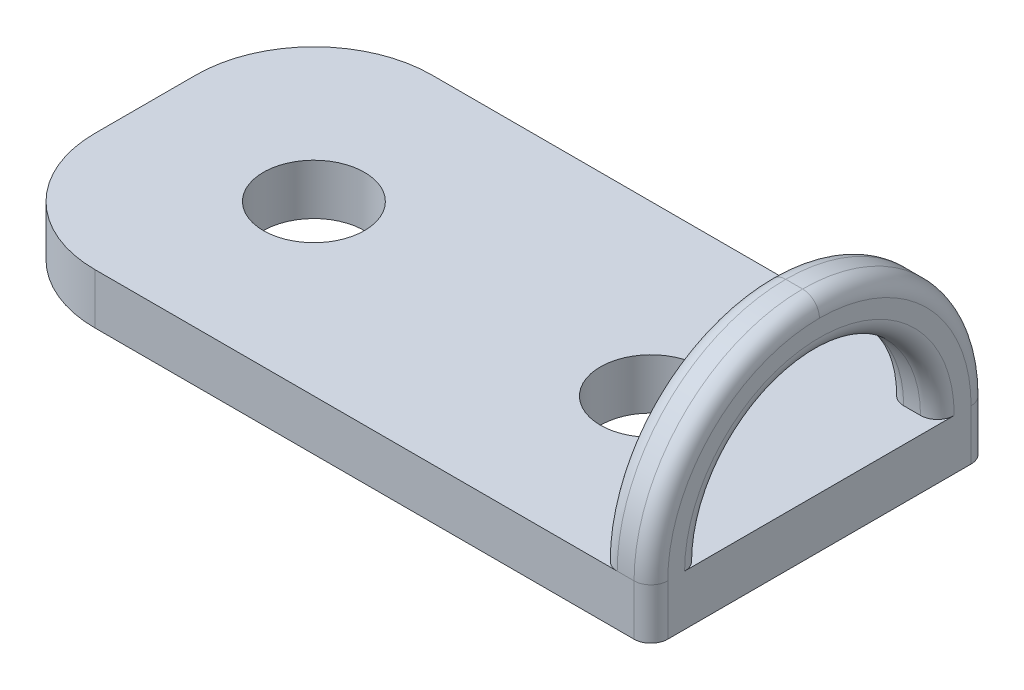
ISO-10303-21;
HEADER;
FILE_DESCRIPTION(('STEP AP214'),'2;1');
FILE_NAME('part.step','',(''),(''),'','','');
FILE_SCHEMA(('AUTOMOTIVE_DESIGN { 1 0 10303 214 1 1 1 1 }'));
ENDSEC;
DATA;
#1=APPLICATION_CONTEXT('core data for automotive mechanical design processes');
#2=APPLICATION_PROTOCOL_DEFINITION('international standard','automotive_design',2000,#1);
#3=PRODUCT_CONTEXT('',#1,'mechanical');
#4=PRODUCT('Part','Part','',(#3));
#5=PRODUCT_RELATED_PRODUCT_CATEGORY('part','',(#4));
#6=PRODUCT_DEFINITION_FORMATION('','',#4);
#7=PRODUCT_DEFINITION_CONTEXT('part definition',#1,'design');
#8=PRODUCT_DEFINITION('design','',#6,#7);
#9=PRODUCT_DEFINITION_SHAPE('','',#8);
#10=(LENGTH_UNIT() NAMED_UNIT(*) SI_UNIT(.MILLI.,.METRE.));
#11=(NAMED_UNIT(*) PLANE_ANGLE_UNIT() SI_UNIT($,.RADIAN.));
#12=(NAMED_UNIT(*) SI_UNIT($,.STERADIAN.) SOLID_ANGLE_UNIT());
#13=UNCERTAINTY_MEASURE_WITH_UNIT(LENGTH_MEASURE(1.E-05),#10,'distance_accuracy_value','');
#14=(GEOMETRIC_REPRESENTATION_CONTEXT(3) GLOBAL_UNCERTAINTY_ASSIGNED_CONTEXT((#13)) GLOBAL_UNIT_ASSIGNED_CONTEXT((#10,
#11,#12)) REPRESENTATION_CONTEXT('',''));
#15=CARTESIAN_POINT('',(0.,0.,0.));
#16=DIRECTION('',(0.,0.,1.));
#17=DIRECTION('',(1.,0.,0.));
#18=AXIS2_PLACEMENT_3D('',#15,#16,#17);
#19=CARTESIAN_POINT('',(-33.,3.,13.));
#20=DIRECTION('',(0.,-1.,0.));
#21=DIRECTION('',(0.,0.,-1.));
#22=AXIS2_PLACEMENT_3D('',#19,#20,#21);
#23=PLANE('',#22);
#24=CARTESIAN_POINT('',(-10.,3.,9.99999999999999));
#25=DIRECTION('',(0.,1.,0.));
#26=DIRECTION('',(0.,0.,1.));
#27=AXIS2_PLACEMENT_3D('',#24,#25,#26);
#28=CIRCLE('',#27,3.);
#29=CARTESIAN_POINT('',(-10.,3.,13.));
#30=VERTEX_POINT('',#29);
#31=EDGE_CURVE('E173',#30,#30,#28,.T.);
#32=ORIENTED_EDGE('',*,*,#31,.F.);
#33=EDGE_LOOP('',(#32));
#34=FACE_BOUND('',#33,.T.);
#35=CARTESIAN_POINT('',(-30.,3.,9.99999999999999));
#36=DIRECTION('',(0.,1.,0.));
#37=DIRECTION('',(0.,0.,1.));
#38=AXIS2_PLACEMENT_3D('',#35,#36,#37);
#39=CIRCLE('',#38,3.);
#40=CARTESIAN_POINT('',(-30.,3.,13.));
#41=VERTEX_POINT('',#40);
#42=EDGE_CURVE('E180',#41,#41,#39,.T.);
#43=ORIENTED_EDGE('',*,*,#42,.F.);
#44=EDGE_LOOP('',(#43));
#45=FACE_BOUND('',#44,.T.);
#46=DIRECTION('',(0.,0.,1.));
#47=VECTOR('',#46,1.);
#48=CARTESIAN_POINT('',(-3.,3.,0.));
#49=LINE('',#48,#47);
#50=CARTESIAN_POINT('',(-3.,3.,0.999999999999999));
#51=VERTEX_POINT('',#50);
#52=CARTESIAN_POINT('',(-3.,3.,2.));
#53=VERTEX_POINT('',#52);
#54=EDGE_CURVE('E172',#51,#53,#49,.T.);
#55=ORIENTED_EDGE('',*,*,#54,.F.);
#56=CARTESIAN_POINT('',(-2.,3.,0.999999999999999));
#57=DIRECTION('',(0.,-1.,0.));
#58=DIRECTION('',(0.,0.,-1.));
#59=AXIS2_PLACEMENT_3D('',#56,#57,#58);
#60=CIRCLE('',#59,1.);
#61=CARTESIAN_POINT('',(-2.,3.,0.));
#62=VERTEX_POINT('',#61);
#63=EDGE_CURVE('E12',#51,#62,#60,.T.);
#64=ORIENTED_EDGE('',*,*,#63,.T.);
#65=DIRECTION('',(-1.,0.,0.));
#66=VECTOR('',#65,1.);
#67=CARTESIAN_POINT('',(0.,3.,0.));
#68=LINE('',#67,#66);
#69=CARTESIAN_POINT('',(-33.,3.,0.));
#70=VERTEX_POINT('',#69);
#71=EDGE_CURVE('E80',#62,#70,#68,.T.);
#72=ORIENTED_EDGE('',*,*,#71,.T.);
#73=CARTESIAN_POINT('',(-33.,3.,7.));
#74=DIRECTION('',(0.,1.,0.));
#75=DIRECTION('',(0.,0.,1.));
#76=AXIS2_PLACEMENT_3D('',#73,#74,#75);
#77=CIRCLE('',#76,7.);
#78=CARTESIAN_POINT('',(-40.,3.,7.00000000000005));
#79=VERTEX_POINT('',#78);
#80=EDGE_CURVE('E187',#70,#79,#77,.T.);
#81=ORIENTED_EDGE('',*,*,#80,.T.);
#82=DIRECTION('',(0.,0.,1.));
#83=VECTOR('',#82,1.);
#84=CARTESIAN_POINT('',(-40.,3.,7.00000000000005));
#85=LINE('',#84,#83);
#86=CARTESIAN_POINT('',(-40.,3.,13.));
#87=VERTEX_POINT('',#86);
#88=EDGE_CURVE('E191',#79,#87,#85,.T.);
#89=ORIENTED_EDGE('',*,*,#88,.T.);
#90=CARTESIAN_POINT('',(-33.,3.,13.));
#91=DIRECTION('',(0.,1.,0.));
#92=DIRECTION('',(0.,0.,-1.));
#93=AXIS2_PLACEMENT_3D('',#90,#91,#92);
#94=CIRCLE('',#93,7.);
#95=CARTESIAN_POINT('',(-32.9999999999999,3.,20.));
#96=VERTEX_POINT('',#95);
#97=EDGE_CURVE('E194',#87,#96,#94,.T.);
#98=ORIENTED_EDGE('',*,*,#97,.T.);
#99=DIRECTION('',(1.,0.,0.));
#100=VECTOR('',#99,1.);
#101=CARTESIAN_POINT('',(0.,3.,20.));
#102=LINE('',#101,#100);
#103=CARTESIAN_POINT('',(-2.,3.,20.));
#104=VERTEX_POINT('',#103);
#105=EDGE_CURVE('E101',#96,#104,#102,.T.);
#106=ORIENTED_EDGE('',*,*,#105,.T.);
#107=CARTESIAN_POINT('',(-2.,3.,19.));
#108=DIRECTION('',(0.,-1.,0.));
#109=DIRECTION('',(0.,0.,-1.));
#110=AXIS2_PLACEMENT_3D('',#107,#108,#109);
#111=CIRCLE('',#110,1.);
#112=CARTESIAN_POINT('',(-3.,3.,19.));
#113=VERTEX_POINT('',#112);
#114=EDGE_CURVE('E271',#104,#113,#111,.T.);
#115=ORIENTED_EDGE('',*,*,#114,.T.);
#116=CARTESIAN_POINT('',(-3.,3.,18.));
#117=VERTEX_POINT('',#116);
#118=EDGE_CURVE('E169',#117,#113,#49,.T.);
#119=ORIENTED_EDGE('',*,*,#118,.F.);
#120=CARTESIAN_POINT('',(-2.,3.,18.));
#121=DIRECTION('',(0.,-1.,0.));
#122=DIRECTION('',(0.,0.,-1.));
#123=AXIS2_PLACEMENT_3D('',#120,#121,#122);
#124=CIRCLE('',#123,1.);
#125=CARTESIAN_POINT('',(-2.,3.,17.));
#126=VERTEX_POINT('',#125);
#127=EDGE_CURVE('E72',#117,#126,#124,.T.);
#128=ORIENTED_EDGE('',*,*,#127,.T.);
#129=DIRECTION('',(-1.,0.,0.));
#130=VECTOR('',#129,1.);
#131=CARTESIAN_POINT('',(0.,3.,17.));
#132=LINE('',#131,#130);
#133=CARTESIAN_POINT('',(-0.999999999999998,3.,17.));
#134=VERTEX_POINT('',#133);
#135=EDGE_CURVE('E156',#134,#126,#132,.T.);
#136=ORIENTED_EDGE('',*,*,#135,.F.);
#137=CARTESIAN_POINT('',(-0.999999999999998,3.,18.));
#138=DIRECTION('',(0.,-1.,0.));
#139=DIRECTION('',(0.,0.,-1.));
#140=AXIS2_PLACEMENT_3D('',#137,#138,#139);
#141=CIRCLE('',#140,1.);
#142=CARTESIAN_POINT('',(0.,3.,18.));
#143=VERTEX_POINT('',#142);
#144=EDGE_CURVE('E149',#134,#143,#141,.T.);
#145=ORIENTED_EDGE('',*,*,#144,.T.);
#146=DIRECTION('',(0.,0.,1.));
#147=VECTOR('',#146,1.);
#148=CARTESIAN_POINT('',(0.,3.,3.));
#149=LINE('',#148,#147);
#150=CARTESIAN_POINT('',(0.,3.,2.));
#151=VERTEX_POINT('',#150);
#152=EDGE_CURVE('E161',#151,#143,#149,.T.);
#153=ORIENTED_EDGE('',*,*,#152,.F.);
#154=CARTESIAN_POINT('',(-1.,3.,2.));
#155=DIRECTION('',(0.,-1.,0.));
#156=DIRECTION('',(0.,0.,-1.));
#157=AXIS2_PLACEMENT_3D('',#154,#155,#156);
#158=CIRCLE('',#157,1.);
#159=CARTESIAN_POINT('',(-1.,3.,3.));
#160=VERTEX_POINT('',#159);
#161=EDGE_CURVE('E160',#151,#160,#158,.T.);
#162=ORIENTED_EDGE('',*,*,#161,.T.);
#163=DIRECTION('',(-1.,0.,0.));
#164=VECTOR('',#163,1.);
#165=CARTESIAN_POINT('',(0.,3.,3.));
#166=LINE('',#165,#164);
#167=CARTESIAN_POINT('',(-2.,3.,3.));
#168=VERTEX_POINT('',#167);
#169=EDGE_CURVE('E154',#160,#168,#166,.T.);
#170=ORIENTED_EDGE('',*,*,#169,.T.);
#171=CARTESIAN_POINT('',(-2.,3.,2.));
#172=DIRECTION('',(0.,-1.,0.));
#173=DIRECTION('',(0.,0.,-1.));
#174=AXIS2_PLACEMENT_3D('',#171,#172,#173);
#175=CIRCLE('',#174,1.);
#176=EDGE_CURVE('E142',#168,#53,#175,.T.);
#177=ORIENTED_EDGE('',*,*,#176,.T.);
#178=EDGE_LOOP('',(#55,#64,#72,#81,#89,#98,#106,#115,#119,#128,#136,#145,#153,#162,#170,#177));
#179=FACE_BOUND('',#178,.T.);
#180=ADVANCED_FACE('F63',(#34,#45,#179),#23,.F.);
#181=CARTESIAN_POINT('',(-33.,0.,13.));
#182=DIRECTION('',(0.,-1.,0.));
#183=DIRECTION('',(0.,0.,-1.));
#184=AXIS2_PLACEMENT_3D('',#181,#182,#183);
#185=PLANE('',#184);
#186=CARTESIAN_POINT('',(-30.,0.,9.99999999999999));
#187=DIRECTION('',(0.,1.,0.));
#188=DIRECTION('',(0.,0.,1.));
#189=AXIS2_PLACEMENT_3D('',#186,#187,#188);
#190=CIRCLE('',#189,3.);
#191=CARTESIAN_POINT('',(-30.,0.,13.));
#192=VERTEX_POINT('',#191);
#193=EDGE_CURVE('E176',#192,#192,#190,.T.);
#194=ORIENTED_EDGE('',*,*,#193,.T.);
#195=EDGE_LOOP('',(#194));
#196=FACE_BOUND('',#195,.T.);
#197=DIRECTION('',(-1.,0.,0.));
#198=VECTOR('',#197,1.);
#199=CARTESIAN_POINT('',(0.,0.,0.));
#200=LINE('',#199,#198);
#201=CARTESIAN_POINT('',(-1.,0.,0.));
#202=VERTEX_POINT('',#201);
#203=CARTESIAN_POINT('',(-33.,0.,0.));
#204=VERTEX_POINT('',#203);
#205=EDGE_CURVE('E200',#202,#204,#200,.T.);
#206=ORIENTED_EDGE('',*,*,#205,.F.);
#207=CARTESIAN_POINT('',(-1.,0.,1.));
#208=DIRECTION('',(0.,-1.,0.));
#209=DIRECTION('',(0.,0.,-1.));
#210=AXIS2_PLACEMENT_3D('',#207,#208,#209);
#211=CIRCLE('',#210,1.);
#212=CARTESIAN_POINT('',(0.,0.,1.));
#213=VERTEX_POINT('',#212);
#214=EDGE_CURVE('E236',#202,#213,#211,.T.);
#215=ORIENTED_EDGE('',*,*,#214,.T.);
#216=DIRECTION('',(0.,0.,-1.));
#217=VECTOR('',#216,1.);
#218=CARTESIAN_POINT('',(0.,0.,0.));
#219=LINE('',#218,#217);
#220=CARTESIAN_POINT('',(0.,0.,19.));
#221=VERTEX_POINT('',#220);
#222=EDGE_CURVE('E183',#221,#213,#219,.T.);
#223=ORIENTED_EDGE('',*,*,#222,.F.);
#224=CARTESIAN_POINT('',(-0.999999999999998,0.,19.));
#225=DIRECTION('',(0.,-1.,0.));
#226=DIRECTION('',(0.,0.,-1.));
#227=AXIS2_PLACEMENT_3D('',#224,#225,#226);
#228=CIRCLE('',#227,1.);
#229=CARTESIAN_POINT('',(-0.999999999999997,0.,20.));
#230=VERTEX_POINT('',#229);
#231=EDGE_CURVE('E233',#221,#230,#228,.T.);
#232=ORIENTED_EDGE('',*,*,#231,.T.);
#233=DIRECTION('',(1.,0.,0.));
#234=VECTOR('',#233,1.);
#235=CARTESIAN_POINT('',(0.,0.,20.));
#236=LINE('',#235,#234);
#237=CARTESIAN_POINT('',(-32.9999999999999,0.,20.));
#238=VERTEX_POINT('',#237);
#239=EDGE_CURVE('E188',#238,#230,#236,.T.);
#240=ORIENTED_EDGE('',*,*,#239,.F.);
#241=CARTESIAN_POINT('',(-33.,0.,13.));
#242=DIRECTION('',(0.,1.,0.));
#243=DIRECTION('',(0.,0.,-1.));
#244=AXIS2_PLACEMENT_3D('',#241,#242,#243);
#245=CIRCLE('',#244,7.);
#246=CARTESIAN_POINT('',(-40.,0.,13.));
#247=VERTEX_POINT('',#246);
#248=EDGE_CURVE('E209',#247,#238,#245,.T.);
#249=ORIENTED_EDGE('',*,*,#248,.F.);
#250=DIRECTION('',(0.,0.,1.));
#251=VECTOR('',#250,1.);
#252=CARTESIAN_POINT('',(-40.,0.,7.00000000000005));
#253=LINE('',#252,#251);
#254=CARTESIAN_POINT('',(-40.,0.,7.00000000000005));
#255=VERTEX_POINT('',#254);
#256=EDGE_CURVE('E206',#255,#247,#253,.T.);
#257=ORIENTED_EDGE('',*,*,#256,.F.);
#258=CARTESIAN_POINT('',(-33.,0.,7.));
#259=DIRECTION('',(0.,1.,0.));
#260=DIRECTION('',(0.,0.,1.));
#261=AXIS2_PLACEMENT_3D('',#258,#259,#260);
#262=CIRCLE('',#261,7.);
#263=EDGE_CURVE('E203',#204,#255,#262,.T.);
#264=ORIENTED_EDGE('',*,*,#263,.F.);
#265=EDGE_LOOP('',(#206,#215,#223,#232,#240,#249,#257,#264));
#266=FACE_BOUND('',#265,.T.);
#267=CARTESIAN_POINT('',(-10.,0.,9.99999999999999));
#268=DIRECTION('',(0.,1.,0.));
#269=DIRECTION('',(0.,0.,1.));
#270=AXIS2_PLACEMENT_3D('',#267,#268,#269);
#271=CIRCLE('',#270,3.);
#272=CARTESIAN_POINT('',(-10.,0.,13.));
#273=VERTEX_POINT('',#272);
#274=EDGE_CURVE('E177',#273,#273,#271,.T.);
#275=ORIENTED_EDGE('',*,*,#274,.T.);
#276=EDGE_LOOP('',(#275));
#277=FACE_BOUND('',#276,.T.);
#278=ADVANCED_FACE('F308',(#196,#266,#277),#185,.T.);
#279=CARTESIAN_POINT('',(0.,3.,0.));
#280=DIRECTION('',(-1.,0.,0.));
#281=DIRECTION('',(0.,0.,1.));
#282=AXIS2_PLACEMENT_3D('',#279,#280,#281);
#283=PLANE('',#282);
#284=ORIENTED_EDGE('',*,*,#222,.T.);
#285=DIRECTION('',(0.,-1.,0.));
#286=VECTOR('',#285,1.);
#287=CARTESIAN_POINT('',(0.,3.,1.));
#288=LINE('',#287,#286);
#289=CARTESIAN_POINT('',(0.,3.,1.));
#290=VERTEX_POINT('',#289);
#291=EDGE_CURVE('E248',#213,#290,#288,.F.);
#292=ORIENTED_EDGE('',*,*,#291,.T.);
#293=CARTESIAN_POINT('',(0.,3.,10.));
#294=DIRECTION('',(-1.,0.,0.));
#295=DIRECTION('',(0.,0.,1.));
#296=AXIS2_PLACEMENT_3D('',#293,#294,#295);
#297=CIRCLE('',#296,9.);
#298=CARTESIAN_POINT('',(0.,12.,10.));
#299=VERTEX_POINT('',#298);
#300=EDGE_CURVE('E239',#290,#299,#297,.F.);
#301=ORIENTED_EDGE('',*,*,#300,.T.);
#302=CARTESIAN_POINT('',(0.,3.,10.));
#303=DIRECTION('',(-1.,0.,0.));
#304=DIRECTION('',(0.,0.,1.));
#305=AXIS2_PLACEMENT_3D('',#302,#303,#304);
#306=CIRCLE('',#305,9.);
#307=CARTESIAN_POINT('',(0.,3.,19.));
#308=VERTEX_POINT('',#307);
#309=EDGE_CURVE('E242',#299,#308,#306,.F.);
#310=ORIENTED_EDGE('',*,*,#309,.T.);
#311=DIRECTION('',(0.,-1.,0.));
#312=VECTOR('',#311,1.);
#313=CARTESIAN_POINT('',(0.,3.,19.));
#314=LINE('',#313,#312);
#315=EDGE_CURVE('E245',#308,#221,#314,.T.);
#316=ORIENTED_EDGE('',*,*,#315,.T.);
#317=EDGE_LOOP('',(#284,#292,#301,#310,#316));
#318=FACE_BOUND('',#317,.T.);
#319=CARTESIAN_POINT('',(0.,3.,9.99999999999999));
#320=DIRECTION('',(-1.,0.,0.));
#321=DIRECTION('',(0.,0.,1.));
#322=AXIS2_PLACEMENT_3D('',#319,#320,#321);
#323=CIRCLE('',#322,7.99999999999999);
#324=EDGE_CURVE('E251',#143,#151,#323,.T.);
#325=ORIENTED_EDGE('',*,*,#324,.T.);
#326=ORIENTED_EDGE('',*,*,#152,.T.);
#327=EDGE_LOOP('',(#325,#326));
#328=FACE_BOUND('',#327,.T.);
#329=ADVANCED_FACE('F300',(#318,#328),#283,.F.);
#330=CARTESIAN_POINT('',(0.,3.,0.));
#331=DIRECTION('',(0.,0.,1.));
#332=DIRECTION('',(1.,0.,0.));
#333=AXIS2_PLACEMENT_3D('',#330,#331,#332);
#334=PLANE('',#333);
#335=DIRECTION('',(-1.,0.,0.));
#336=VECTOR('',#335,1.);
#337=CARTESIAN_POINT('',(0.,3.,0.));
#338=LINE('',#337,#336);
#339=CARTESIAN_POINT('',(-1.,3.,0.));
#340=VERTEX_POINT('',#339);
#341=EDGE_CURVE('E224',#62,#340,#338,.F.);
#342=ORIENTED_EDGE('',*,*,#341,.T.);
#343=DIRECTION('',(0.,-1.,0.));
#344=VECTOR('',#343,1.);
#345=CARTESIAN_POINT('',(-1.,3.,0.));
#346=LINE('',#345,#344);
#347=EDGE_CURVE('E228',#340,#202,#346,.T.);
#348=ORIENTED_EDGE('',*,*,#347,.T.);
#349=ORIENTED_EDGE('',*,*,#205,.T.);
#350=DIRECTION('',(0.,-1.,0.));
#351=VECTOR('',#350,1.);
#352=CARTESIAN_POINT('',(-33.,3.,0.));
#353=LINE('',#352,#351);
#354=EDGE_CURVE('E221',#70,#204,#353,.T.);
#355=ORIENTED_EDGE('',*,*,#354,.F.);
#356=ORIENTED_EDGE('',*,*,#71,.F.);
#357=EDGE_LOOP('',(#342,#348,#349,#355,#356));
#358=FACE_BOUND('',#357,.T.);
#359=ADVANCED_FACE('F319',(#358),#334,.F.);
#360=CARTESIAN_POINT('',(-33.,3.,7.));
#361=DIRECTION('',(0.,-1.,0.));
#362=DIRECTION('',(0.,0.,-1.));
#363=AXIS2_PLACEMENT_3D('',#360,#361,#362);
#364=CYLINDRICAL_SURFACE('',#363,7.);
#365=ORIENTED_EDGE('',*,*,#263,.T.);
#366=DIRECTION('',(0.,-1.,0.));
#367=VECTOR('',#366,1.);
#368=CARTESIAN_POINT('',(-40.,3.,7.00000000000005));
#369=LINE('',#368,#367);
#370=EDGE_CURVE('E218',#79,#255,#369,.T.);
#371=ORIENTED_EDGE('',*,*,#370,.F.);
#372=ORIENTED_EDGE('',*,*,#80,.F.);
#373=ORIENTED_EDGE('',*,*,#354,.T.);
#374=EDGE_LOOP('',(#365,#371,#372,#373));
#375=FACE_BOUND('',#374,.T.);
#376=ADVANCED_FACE('F371',(#375),#364,.T.);
#377=CARTESIAN_POINT('',(-40.,3.,7.00000000000005));
#378=DIRECTION('',(1.,0.,0.));
#379=DIRECTION('',(0.,0.,-1.));
#380=AXIS2_PLACEMENT_3D('',#377,#378,#379);
#381=PLANE('',#380);
#382=ORIENTED_EDGE('',*,*,#256,.T.);
#383=DIRECTION('',(0.,-1.,0.));
#384=VECTOR('',#383,1.);
#385=CARTESIAN_POINT('',(-40.,3.,13.));
#386=LINE('',#385,#384);
#387=EDGE_CURVE('E215',#87,#247,#386,.T.);
#388=ORIENTED_EDGE('',*,*,#387,.F.);
#389=ORIENTED_EDGE('',*,*,#88,.F.);
#390=ORIENTED_EDGE('',*,*,#370,.T.);
#391=EDGE_LOOP('',(#382,#388,#389,#390));
#392=FACE_BOUND('',#391,.T.);
#393=ADVANCED_FACE('F367',(#392),#381,.F.);
#394=CARTESIAN_POINT('',(-33.,3.,13.));
#395=DIRECTION('',(0.,-1.,0.));
#396=DIRECTION('',(0.,0.,-1.));
#397=AXIS2_PLACEMENT_3D('',#394,#395,#396);
#398=CYLINDRICAL_SURFACE('',#397,7.);
#399=ORIENTED_EDGE('',*,*,#248,.T.);
#400=DIRECTION('',(0.,-1.,0.));
#401=VECTOR('',#400,1.);
#402=CARTESIAN_POINT('',(-32.9999999999999,3.,20.));
#403=LINE('',#402,#401);
#404=EDGE_CURVE('E197',#96,#238,#403,.T.);
#405=ORIENTED_EDGE('',*,*,#404,.F.);
#406=ORIENTED_EDGE('',*,*,#97,.F.);
#407=ORIENTED_EDGE('',*,*,#387,.T.);
#408=EDGE_LOOP('',(#399,#405,#406,#407));
#409=FACE_BOUND('',#408,.T.);
#410=ADVANCED_FACE('F364',(#409),#398,.T.);
#411=CARTESIAN_POINT('',(0.,3.,20.));
#412=DIRECTION('',(0.,0.,-1.));
#413=DIRECTION('',(-1.,0.,0.));
#414=AXIS2_PLACEMENT_3D('',#411,#412,#413);
#415=PLANE('',#414);
#416=ORIENTED_EDGE('',*,*,#239,.T.);
#417=DIRECTION('',(0.,-1.,0.));
#418=VECTOR('',#417,1.);
#419=CARTESIAN_POINT('',(-0.999999999999997,3.,20.));
#420=LINE('',#419,#418);
#421=CARTESIAN_POINT('',(-0.999999999999997,3.,20.));
#422=VERTEX_POINT('',#421);
#423=EDGE_CURVE('E113',#230,#422,#420,.F.);
#424=ORIENTED_EDGE('',*,*,#423,.T.);
#425=DIRECTION('',(1.,0.,0.));
#426=VECTOR('',#425,1.);
#427=CARTESIAN_POINT('',(-3.,3.,20.));
#428=LINE('',#427,#426);
#429=EDGE_CURVE('E226',#422,#104,#428,.F.);
#430=ORIENTED_EDGE('',*,*,#429,.T.);
#431=ORIENTED_EDGE('',*,*,#105,.F.);
#432=ORIENTED_EDGE('',*,*,#404,.T.);
#433=EDGE_LOOP('',(#416,#424,#430,#431,#432));
#434=FACE_BOUND('',#433,.T.);
#435=ADVANCED_FACE('F361',(#434),#415,.F.);
#436=CARTESIAN_POINT('',(-30.,3.,9.99999999999999));
#437=DIRECTION('',(0.,-1.,0.));
#438=DIRECTION('',(0.,0.,-1.));
#439=AXIS2_PLACEMENT_3D('',#436,#437,#438);
#440=CYLINDRICAL_SURFACE('',#439,3.);
#441=ORIENTED_EDGE('',*,*,#42,.T.);
#442=EDGE_LOOP('',(#441));
#443=FACE_BOUND('',#442,.T.);
#444=ORIENTED_EDGE('',*,*,#193,.F.);
#445=EDGE_LOOP('',(#444));
#446=FACE_BOUND('',#445,.T.);
#447=ADVANCED_FACE('F358',(#443,#446),#440,.F.);
#448=CARTESIAN_POINT('',(-10.,3.,9.99999999999999));
#449=DIRECTION('',(0.,-1.,0.));
#450=DIRECTION('',(0.,0.,-1.));
#451=AXIS2_PLACEMENT_3D('',#448,#449,#450);
#452=CYLINDRICAL_SURFACE('',#451,3.);
#453=ORIENTED_EDGE('',*,*,#31,.T.);
#454=EDGE_LOOP('',(#453));
#455=FACE_BOUND('',#454,.T.);
#456=ORIENTED_EDGE('',*,*,#274,.F.);
#457=EDGE_LOOP('',(#456));
#458=FACE_BOUND('',#457,.T.);
#459=ADVANCED_FACE('F431',(#455,#458),#452,.F.);
#460=CARTESIAN_POINT('',(-3.,13.,0.));
#461=DIRECTION('',(1.,0.,0.));
#462=DIRECTION('',(0.,0.,-1.));
#463=AXIS2_PLACEMENT_3D('',#460,#461,#462);
#464=PLANE('',#463);
#465=ORIENTED_EDGE('',*,*,#54,.T.);
#466=CARTESIAN_POINT('',(-3.,3.,9.99999999999999));
#467=DIRECTION('',(1.,0.,0.));
#468=DIRECTION('',(0.,0.,-1.));
#469=AXIS2_PLACEMENT_3D('',#466,#467,#468);
#470=CIRCLE('',#469,7.99999999999999);
#471=EDGE_CURVE('E145',#53,#117,#470,.T.);
#472=ORIENTED_EDGE('',*,*,#471,.T.);
#473=ORIENTED_EDGE('',*,*,#118,.T.);
#474=CARTESIAN_POINT('',(-3.,3.,10.));
#475=DIRECTION('',(1.,0.,0.));
#476=DIRECTION('',(0.,0.,-1.));
#477=AXIS2_PLACEMENT_3D('',#474,#475,#476);
#478=CIRCLE('',#477,9.);
#479=CARTESIAN_POINT('',(-3.,12.,10.));
#480=VERTEX_POINT('',#479);
#481=EDGE_CURVE('E261',#113,#480,#478,.F.);
#482=ORIENTED_EDGE('',*,*,#481,.T.);
#483=CARTESIAN_POINT('',(-3.,3.,10.));
#484=DIRECTION('',(1.,0.,0.));
#485=DIRECTION('',(0.,0.,-1.));
#486=AXIS2_PLACEMENT_3D('',#483,#484,#485);
#487=CIRCLE('',#486,9.);
#488=EDGE_CURVE('E259',#480,#51,#487,.F.);
#489=ORIENTED_EDGE('',*,*,#488,.T.);
#490=EDGE_LOOP('',(#465,#472,#473,#482,#489));
#491=FACE_BOUND('',#490,.T.);
#492=ADVANCED_FACE('F386',(#491),#464,.F.);
#493=CARTESIAN_POINT('',(0.,3.,10.));
#494=DIRECTION('',(-1.,0.,0.));
#495=DIRECTION('',(0.,0.,1.));
#496=AXIS2_PLACEMENT_3D('',#493,#494,#495);
#497=CYLINDRICAL_SURFACE('',#496,10.);
#498=ORIENTED_EDGE('',*,*,#429,.F.);
#499=CARTESIAN_POINT('',(-0.999999999999999,3.,10.));
#500=DIRECTION('',(-1.,0.,0.));
#501=DIRECTION('',(0.,0.,1.));
#502=AXIS2_PLACEMENT_3D('',#499,#500,#501);
#503=CIRCLE('',#502,10.);
#504=CARTESIAN_POINT('',(-0.999999999999999,13.,10.));
#505=VERTEX_POINT('',#504);
#506=EDGE_CURVE('E257',#422,#505,#503,.T.);
#507=ORIENTED_EDGE('',*,*,#506,.T.);
#508=DIRECTION('',(1.,0.,0.));
#509=VECTOR('',#508,1.);
#510=CARTESIAN_POINT('',(0.,13.,10.));
#511=LINE('',#510,#509);
#512=CARTESIAN_POINT('',(-2.,13.,10.));
#513=VERTEX_POINT('',#512);
#514=EDGE_CURVE('E163',#513,#505,#511,.T.);
#515=ORIENTED_EDGE('',*,*,#514,.F.);
#516=CARTESIAN_POINT('',(-2.,3.,10.));
#517=DIRECTION('',(1.,0.,0.));
#518=DIRECTION('',(0.,0.,-1.));
#519=AXIS2_PLACEMENT_3D('',#516,#517,#518);
#520=CIRCLE('',#519,10.);
#521=EDGE_CURVE('E255',#513,#104,#520,.T.);
#522=ORIENTED_EDGE('',*,*,#521,.T.);
#523=EDGE_LOOP('',(#498,#507,#515,#522));
#524=FACE_BOUND('',#523,.T.);
#525=ADVANCED_FACE('F383',(#524),#497,.T.);
#526=CARTESIAN_POINT('',(0.,3.,10.));
#527=DIRECTION('',(1.,0.,0.));
#528=DIRECTION('',(0.,0.,-1.));
#529=AXIS2_PLACEMENT_3D('',#526,#527,#528);
#530=CYLINDRICAL_SURFACE('',#529,10.);
#531=ORIENTED_EDGE('',*,*,#514,.T.);
#532=CARTESIAN_POINT('',(-0.999999999999999,3.,10.));
#533=DIRECTION('',(-1.,0.,0.));
#534=DIRECTION('',(0.,0.,1.));
#535=AXIS2_PLACEMENT_3D('',#532,#533,#534);
#536=CIRCLE('',#535,10.);
#537=EDGE_CURVE('E268',#505,#340,#536,.T.);
#538=ORIENTED_EDGE('',*,*,#537,.T.);
#539=ORIENTED_EDGE('',*,*,#341,.F.);
#540=CARTESIAN_POINT('',(-2.,3.,10.));
#541=DIRECTION('',(1.,0.,0.));
#542=DIRECTION('',(0.,0.,-1.));
#543=AXIS2_PLACEMENT_3D('',#540,#541,#542);
#544=CIRCLE('',#543,10.);
#545=EDGE_CURVE('E266',#62,#513,#544,.T.);
#546=ORIENTED_EDGE('',*,*,#545,.T.);
#547=EDGE_LOOP('',(#531,#538,#539,#546));
#548=FACE_BOUND('',#547,.T.);
#549=ADVANCED_FACE('F380',(#548),#530,.T.);
#550=CARTESIAN_POINT('',(0.,3.,9.99999999999999));
#551=DIRECTION('',(-1.,0.,0.));
#552=DIRECTION('',(0.,0.,1.));
#553=AXIS2_PLACEMENT_3D('',#550,#551,#552);
#554=CYLINDRICAL_SURFACE('',#553,6.99999999999999);
#555=ORIENTED_EDGE('',*,*,#169,.F.);
#556=CARTESIAN_POINT('',(-0.999999999999999,3.,9.99999999999999));
#557=DIRECTION('',(-1.,0.,0.));
#558=DIRECTION('',(0.,0.,1.));
#559=AXIS2_PLACEMENT_3D('',#556,#557,#558);
#560=CIRCLE('',#559,6.99999999999999);
#561=EDGE_CURVE('E157',#160,#134,#560,.F.);
#562=ORIENTED_EDGE('',*,*,#561,.T.);
#563=ORIENTED_EDGE('',*,*,#135,.T.);
#564=CARTESIAN_POINT('',(-2.,3.,9.99999999999999));
#565=DIRECTION('',(1.,0.,0.));
#566=DIRECTION('',(0.,0.,-1.));
#567=AXIS2_PLACEMENT_3D('',#564,#565,#566);
#568=CIRCLE('',#567,6.99999999999999);
#569=EDGE_CURVE('E144',#126,#168,#568,.F.);
#570=ORIENTED_EDGE('',*,*,#569,.T.);
#571=EDGE_LOOP('',(#555,#562,#563,#570));
#572=FACE_BOUND('',#571,.T.);
#573=ADVANCED_FACE('F153',(#572),#554,.F.);
#574=CARTESIAN_POINT('',(-0.999999999999998,3.,19.));
#575=DIRECTION('',(0.,-1.,0.));
#576=DIRECTION('',(0.,0.,-1.));
#577=AXIS2_PLACEMENT_3D('',#574,#575,#576);
#578=CYLINDRICAL_SURFACE('',#577,1.);
#579=ORIENTED_EDGE('',*,*,#231,.F.);
#580=ORIENTED_EDGE('',*,*,#315,.F.);
#581=CARTESIAN_POINT('',(-0.999999999999998,3.,19.));
#582=DIRECTION('',(0.,1.,0.));
#583=DIRECTION('',(0.,0.,1.));
#584=AXIS2_PLACEMENT_3D('',#581,#582,#583);
#585=CIRCLE('',#584,1.);
#586=EDGE_CURVE('E166',#422,#308,#585,.T.);
#587=ORIENTED_EDGE('',*,*,#586,.F.);
#588=ORIENTED_EDGE('',*,*,#423,.F.);
#589=EDGE_LOOP('',(#579,#580,#587,#588));
#590=FACE_BOUND('',#589,.T.);
#591=ADVANCED_FACE('F295',(#590),#578,.T.);
#592=CARTESIAN_POINT('',(-0.999999999999999,3.,10.));
#593=DIRECTION('',(-1.,0.,0.));
#594=DIRECTION('',(0.,0.,1.));
#595=AXIS2_PLACEMENT_3D('',#592,#593,#594);
#596=TOROIDAL_SURFACE('',#595,9.,1.);
#597=ORIENTED_EDGE('',*,*,#586,.T.);
#598=ORIENTED_EDGE('',*,*,#309,.F.);
#599=CARTESIAN_POINT('',(-0.999999999999999,12.,10.));
#600=DIRECTION('',(0.,0.,-1.));
#601=DIRECTION('',(-1.,0.,0.));
#602=AXIS2_PLACEMENT_3D('',#599,#600,#601);
#603=CIRCLE('',#602,1.);
#604=EDGE_CURVE('E280',#505,#299,#603,.T.);
#605=ORIENTED_EDGE('',*,*,#604,.F.);
#606=ORIENTED_EDGE('',*,*,#506,.F.);
#607=EDGE_LOOP('',(#597,#598,#605,#606));
#608=FACE_BOUND('',#607,.T.);
#609=ADVANCED_FACE('F288',(#608),#596,.T.);
#610=CARTESIAN_POINT('',(-0.999999999999999,3.,10.));
#611=DIRECTION('',(-1.,0.,0.));
#612=DIRECTION('',(0.,0.,1.));
#613=AXIS2_PLACEMENT_3D('',#610,#611,#612);
#614=TOROIDAL_SURFACE('',#613,9.,1.);
#615=ORIENTED_EDGE('',*,*,#604,.T.);
#616=ORIENTED_EDGE('',*,*,#300,.F.);
#617=CARTESIAN_POINT('',(-1.,3.,1.));
#618=DIRECTION('',(0.,-1.,0.));
#619=DIRECTION('',(0.,0.,-1.));
#620=AXIS2_PLACEMENT_3D('',#617,#618,#619);
#621=CIRCLE('',#620,1.);
#622=EDGE_CURVE('E277',#340,#290,#621,.T.);
#623=ORIENTED_EDGE('',*,*,#622,.F.);
#624=ORIENTED_EDGE('',*,*,#537,.F.);
#625=EDGE_LOOP('',(#615,#616,#623,#624));
#626=FACE_BOUND('',#625,.T.);
#627=ADVANCED_FACE('F328',(#626),#614,.T.);
#628=CARTESIAN_POINT('',(-1.,3.,1.));
#629=DIRECTION('',(0.,-1.,0.));
#630=DIRECTION('',(0.,0.,-1.));
#631=AXIS2_PLACEMENT_3D('',#628,#629,#630);
#632=CYLINDRICAL_SURFACE('',#631,1.);
#633=ORIENTED_EDGE('',*,*,#622,.T.);
#634=ORIENTED_EDGE('',*,*,#291,.F.);
#635=ORIENTED_EDGE('',*,*,#214,.F.);
#636=ORIENTED_EDGE('',*,*,#347,.F.);
#637=EDGE_LOOP('',(#633,#634,#635,#636));
#638=FACE_BOUND('',#637,.T.);
#639=ADVANCED_FACE('F316',(#638),#632,.T.);
#640=CARTESIAN_POINT('',(-2.,3.,10.));
#641=DIRECTION('',(1.,0.,0.));
#642=DIRECTION('',(0.,0.,-1.));
#643=AXIS2_PLACEMENT_3D('',#640,#641,#642);
#644=TOROIDAL_SURFACE('',#643,9.,1.);
#645=ORIENTED_EDGE('',*,*,#63,.F.);
#646=ORIENTED_EDGE('',*,*,#488,.F.);
#647=CARTESIAN_POINT('',(-2.,12.,10.));
#648=DIRECTION('',(0.,0.,1.));
#649=DIRECTION('',(1.,0.,0.));
#650=AXIS2_PLACEMENT_3D('',#647,#648,#649);
#651=CIRCLE('',#650,1.);
#652=EDGE_CURVE('E67',#513,#480,#651,.T.);
#653=ORIENTED_EDGE('',*,*,#652,.F.);
#654=ORIENTED_EDGE('',*,*,#545,.F.);
#655=EDGE_LOOP('',(#645,#646,#653,#654));
#656=FACE_BOUND('',#655,.T.);
#657=ADVANCED_FACE('F343',(#656),#644,.T.);
#658=CARTESIAN_POINT('',(-2.,3.,10.));
#659=DIRECTION('',(1.,0.,0.));
#660=DIRECTION('',(0.,0.,-1.));
#661=AXIS2_PLACEMENT_3D('',#658,#659,#660);
#662=TOROIDAL_SURFACE('',#661,9.,1.);
#663=ORIENTED_EDGE('',*,*,#114,.F.);
#664=ORIENTED_EDGE('',*,*,#521,.F.);
#665=ORIENTED_EDGE('',*,*,#652,.T.);
#666=ORIENTED_EDGE('',*,*,#481,.F.);
#667=EDGE_LOOP('',(#663,#664,#665,#666));
#668=FACE_BOUND('',#667,.T.);
#669=ADVANCED_FACE('F338',(#668),#662,.T.);
#670=CARTESIAN_POINT('',(-0.999999999999999,3.,9.99999999999999));
#671=DIRECTION('',(-1.,0.,0.));
#672=DIRECTION('',(0.,0.,1.));
#673=AXIS2_PLACEMENT_3D('',#670,#671,#672);
#674=TOROIDAL_SURFACE('',#673,7.99999999999999,1.);
#675=ORIENTED_EDGE('',*,*,#144,.F.);
#676=ORIENTED_EDGE('',*,*,#561,.F.);
#677=ORIENTED_EDGE('',*,*,#161,.F.);
#678=ORIENTED_EDGE('',*,*,#324,.F.);
#679=EDGE_LOOP('',(#675,#676,#677,#678));
#680=FACE_BOUND('',#679,.T.);
#681=ADVANCED_FACE('F336',(#680),#674,.T.);
#682=CARTESIAN_POINT('',(-2.,3.,9.99999999999999));
#683=DIRECTION('',(1.,0.,0.));
#684=DIRECTION('',(0.,0.,-1.));
#685=AXIS2_PLACEMENT_3D('',#682,#683,#684);
#686=TOROIDAL_SURFACE('',#685,7.99999999999999,1.);
#687=ORIENTED_EDGE('',*,*,#127,.F.);
#688=ORIENTED_EDGE('',*,*,#471,.F.);
#689=ORIENTED_EDGE('',*,*,#176,.F.);
#690=ORIENTED_EDGE('',*,*,#569,.F.);
#691=EDGE_LOOP('',(#687,#688,#689,#690));
#692=FACE_BOUND('',#691,.T.);
#693=ADVANCED_FACE('F65',(#692),#686,.T.);
#694=CLOSED_SHELL('',(#180,#278,#329,#359,#376,#393,#410,#435,#447,#459,#492,#525,#549,#573,
#591,#609,#627,#639,#657,#669,#681,#693));
#695=MANIFOLD_SOLID_BREP('B2',#694);
#696=ADVANCED_BREP_SHAPE_REPRESENTATION('',(#18,#695),#14);
#697=SHAPE_DEFINITION_REPRESENTATION(#9,#696);
ENDSEC;
END-ISO-10303-21;
